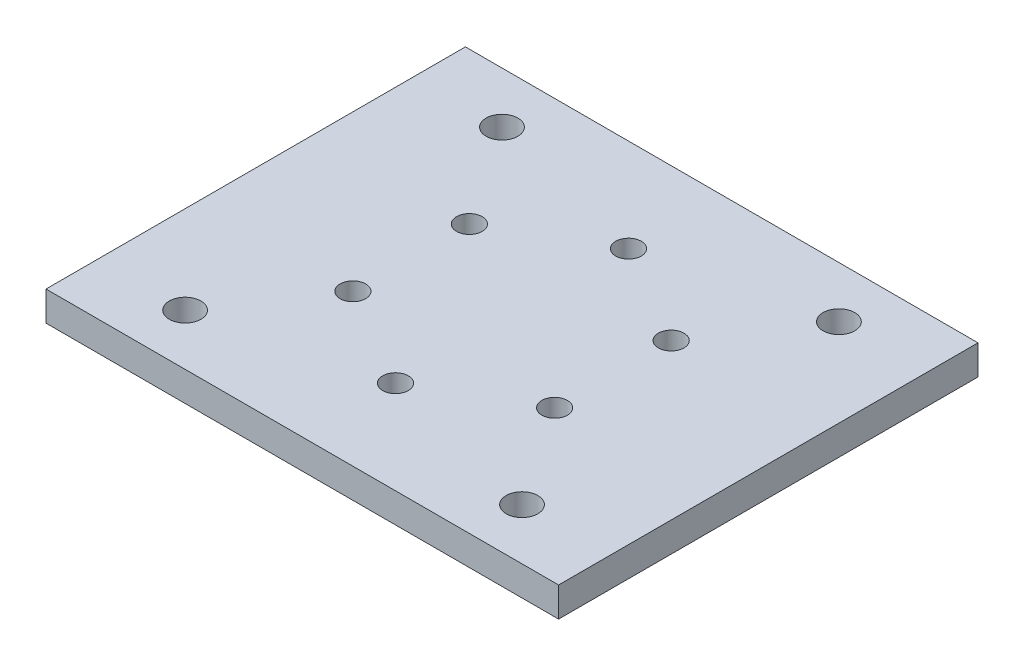
ISO-10303-21;
HEADER;
FILE_DESCRIPTION(('STEP AP214'),'2;1');
FILE_NAME('part.step','',(''),(''),'','','');
FILE_SCHEMA(('AUTOMOTIVE_DESIGN { 1 0 10303 214 1 1 1 1 }'));
ENDSEC;
DATA;
#1=APPLICATION_CONTEXT('core data for automotive mechanical design processes');
#2=APPLICATION_PROTOCOL_DEFINITION('international standard','automotive_design',2000,#1);
#3=PRODUCT_CONTEXT('',#1,'mechanical');
#4=PRODUCT('Part','Part','',(#3));
#5=PRODUCT_RELATED_PRODUCT_CATEGORY('part','',(#4));
#6=PRODUCT_DEFINITION_FORMATION('','',#4);
#7=PRODUCT_DEFINITION_CONTEXT('part definition',#1,'design');
#8=PRODUCT_DEFINITION('design','',#6,#7);
#9=PRODUCT_DEFINITION_SHAPE('','',#8);
#10=(LENGTH_UNIT() NAMED_UNIT(*) SI_UNIT(.MILLI.,.METRE.));
#11=(NAMED_UNIT(*) PLANE_ANGLE_UNIT() SI_UNIT($,.RADIAN.));
#12=(NAMED_UNIT(*) SI_UNIT($,.STERADIAN.) SOLID_ANGLE_UNIT());
#13=UNCERTAINTY_MEASURE_WITH_UNIT(LENGTH_MEASURE(1.E-05),#10,'distance_accuracy_value','');
#14=(GEOMETRIC_REPRESENTATION_CONTEXT(3) GLOBAL_UNCERTAINTY_ASSIGNED_CONTEXT((#13)) GLOBAL_UNIT_ASSIGNED_CONTEXT((#10,
#11,#12)) REPRESENTATION_CONTEXT('',''));
#15=CARTESIAN_POINT('',(0.,0.,0.));
#16=DIRECTION('',(0.,0.,1.));
#17=DIRECTION('',(1.,0.,0.));
#18=AXIS2_PLACEMENT_3D('',#15,#16,#17);
#19=CARTESIAN_POINT('',(110.,6.35,0.));
#20=DIRECTION('',(0.,0.,-1.));
#21=DIRECTION('',(-1.,0.,0.));
#22=AXIS2_PLACEMENT_3D('',#19,#20,#21);
#23=PLANE('',#22);
#24=DIRECTION('',(1.,0.,0.));
#25=VECTOR('',#24,1.);
#26=CARTESIAN_POINT('',(110.,0.,0.));
#27=LINE('',#26,#25);
#28=CARTESIAN_POINT('',(0.,0.,0.));
#29=VERTEX_POINT('',#28);
#30=CARTESIAN_POINT('',(110.,0.,0.));
#31=VERTEX_POINT('',#30);
#32=EDGE_CURVE('E100',#29,#31,#27,.T.);
#33=ORIENTED_EDGE('',*,*,#32,.T.);
#34=DIRECTION('',(0.,-1.,0.));
#35=VECTOR('',#34,1.);
#36=CARTESIAN_POINT('',(110.,6.35,0.));
#37=LINE('',#36,#35);
#38=CARTESIAN_POINT('',(110.,6.35,0.));
#39=VERTEX_POINT('',#38);
#40=EDGE_CURVE('E11',#39,#31,#37,.T.);
#41=ORIENTED_EDGE('',*,*,#40,.F.);
#42=DIRECTION('',(1.,0.,0.));
#43=VECTOR('',#42,1.);
#44=CARTESIAN_POINT('',(110.,6.35,0.));
#45=LINE('',#44,#43);
#46=CARTESIAN_POINT('',(0.,6.35,0.));
#47=VERTEX_POINT('',#46);
#48=EDGE_CURVE('E88',#47,#39,#45,.T.);
#49=ORIENTED_EDGE('',*,*,#48,.F.);
#50=DIRECTION('',(0.,-1.,0.));
#51=VECTOR('',#50,1.);
#52=CARTESIAN_POINT('',(0.,6.35,0.));
#53=LINE('',#52,#51);
#54=EDGE_CURVE('E96',#47,#29,#53,.T.);
#55=ORIENTED_EDGE('',*,*,#54,.T.);
#56=EDGE_LOOP('',(#33,#41,#49,#55));
#57=FACE_BOUND('',#56,.T.);
#58=ADVANCED_FACE('F37',(#57),#23,.F.);
#59=CARTESIAN_POINT('',(110.,6.35,-90.));
#60=DIRECTION('',(-1.,0.,0.));
#61=DIRECTION('',(0.,0.,1.));
#62=AXIS2_PLACEMENT_3D('',#59,#60,#61);
#63=PLANE('',#62);
#64=DIRECTION('',(0.,0.,-1.));
#65=VECTOR('',#64,1.);
#66=CARTESIAN_POINT('',(110.,0.,-90.));
#67=LINE('',#66,#65);
#68=CARTESIAN_POINT('',(110.,0.,-90.));
#69=VERTEX_POINT('',#68);
#70=EDGE_CURVE('E92',#31,#69,#67,.T.);
#71=ORIENTED_EDGE('',*,*,#70,.T.);
#72=DIRECTION('',(0.,-1.,0.));
#73=VECTOR('',#72,1.);
#74=CARTESIAN_POINT('',(110.,6.35,-90.));
#75=LINE('',#74,#73);
#76=CARTESIAN_POINT('',(110.,6.35,-90.));
#77=VERTEX_POINT('',#76);
#78=EDGE_CURVE('E45',#77,#69,#75,.T.);
#79=ORIENTED_EDGE('',*,*,#78,.F.);
#80=DIRECTION('',(0.,0.,-1.));
#81=VECTOR('',#80,1.);
#82=CARTESIAN_POINT('',(110.,6.35,-90.));
#83=LINE('',#82,#81);
#84=EDGE_CURVE('E83',#39,#77,#83,.T.);
#85=ORIENTED_EDGE('',*,*,#84,.F.);
#86=ORIENTED_EDGE('',*,*,#40,.T.);
#87=EDGE_LOOP('',(#71,#79,#85,#86));
#88=FACE_BOUND('',#87,.T.);
#89=ADVANCED_FACE('F91',(#88),#63,.F.);
#90=CARTESIAN_POINT('',(0.,6.35,-90.));
#91=DIRECTION('',(0.,0.,1.));
#92=DIRECTION('',(1.,0.,0.));
#93=AXIS2_PLACEMENT_3D('',#90,#91,#92);
#94=PLANE('',#93);
#95=DIRECTION('',(-1.,0.,0.));
#96=VECTOR('',#95,1.);
#97=CARTESIAN_POINT('',(0.,0.,-90.));
#98=LINE('',#97,#96);
#99=CARTESIAN_POINT('',(0.,0.,-90.));
#100=VERTEX_POINT('',#99);
#101=EDGE_CURVE('E70',#69,#100,#98,.T.);
#102=ORIENTED_EDGE('',*,*,#101,.T.);
#103=DIRECTION('',(0.,-1.,0.));
#104=VECTOR('',#103,1.);
#105=CARTESIAN_POINT('',(0.,6.35,-90.));
#106=LINE('',#105,#104);
#107=CARTESIAN_POINT('',(0.,6.35,-90.));
#108=VERTEX_POINT('',#107);
#109=EDGE_CURVE('E93',#108,#100,#106,.T.);
#110=ORIENTED_EDGE('',*,*,#109,.F.);
#111=DIRECTION('',(-1.,0.,0.));
#112=VECTOR('',#111,1.);
#113=CARTESIAN_POINT('',(0.,6.35,-90.));
#114=LINE('',#113,#112);
#115=EDGE_CURVE('E86',#77,#108,#114,.T.);
#116=ORIENTED_EDGE('',*,*,#115,.F.);
#117=ORIENTED_EDGE('',*,*,#78,.T.);
#118=EDGE_LOOP('',(#102,#110,#116,#117));
#119=FACE_BOUND('',#118,.T.);
#120=ADVANCED_FACE('F94',(#119),#94,.F.);
#121=CARTESIAN_POINT('',(0.,6.35,0.));
#122=DIRECTION('',(1.,0.,0.));
#123=DIRECTION('',(0.,0.,-1.));
#124=AXIS2_PLACEMENT_3D('',#121,#122,#123);
#125=PLANE('',#124);
#126=DIRECTION('',(0.,0.,1.));
#127=VECTOR('',#126,1.);
#128=CARTESIAN_POINT('',(0.,0.,0.));
#129=LINE('',#128,#127);
#130=EDGE_CURVE('E76',#100,#29,#129,.T.);
#131=ORIENTED_EDGE('',*,*,#130,.T.);
#132=ORIENTED_EDGE('',*,*,#54,.F.);
#133=DIRECTION('',(0.,0.,1.));
#134=VECTOR('',#133,1.);
#135=CARTESIAN_POINT('',(0.,6.35,0.));
#136=LINE('',#135,#134);
#137=EDGE_CURVE('E53',#108,#47,#136,.T.);
#138=ORIENTED_EDGE('',*,*,#137,.F.);
#139=ORIENTED_EDGE('',*,*,#109,.T.);
#140=EDGE_LOOP('',(#131,#132,#138,#139));
#141=FACE_BOUND('',#140,.T.);
#142=ADVANCED_FACE('F108',(#141),#125,.F.);
#143=CARTESIAN_POINT('',(0.,6.35,0.));
#144=DIRECTION('',(0.,-1.,0.));
#145=DIRECTION('',(0.,0.,-1.));
#146=AXIS2_PLACEMENT_3D('',#143,#144,#145);
#147=PLANE('',#146);
#148=CARTESIAN_POINT('',(55.,6.35,-70.));
#149=DIRECTION('',(0.,1.,0.));
#150=DIRECTION('',(0.,0.,1.));
#151=AXIS2_PLACEMENT_3D('',#148,#149,#150);
#152=CIRCLE('',#151,2.75);
#153=CARTESIAN_POINT('',(55.,6.35,-67.25));
#154=VERTEX_POINT('',#153);
#155=EDGE_CURVE('E163',#154,#154,#152,.T.);
#156=ORIENTED_EDGE('',*,*,#155,.F.);
#157=EDGE_LOOP('',(#156));
#158=FACE_BOUND('',#157,.T.);
#159=CARTESIAN_POINT('',(33.3493649053895,6.35,-57.4999999999997));
#160=DIRECTION('',(0.,1.,0.));
#161=DIRECTION('',(0.,0.,1.));
#162=AXIS2_PLACEMENT_3D('',#159,#160,#161);
#163=CIRCLE('',#162,2.75);
#164=CARTESIAN_POINT('',(33.3493649053895,6.35,-54.7499999999997));
#165=VERTEX_POINT('',#164);
#166=EDGE_CURVE('E142',#165,#165,#163,.T.);
#167=ORIENTED_EDGE('',*,*,#166,.F.);
#168=EDGE_LOOP('',(#167));
#169=FACE_BOUND('',#168,.T.);
#170=CARTESIAN_POINT('',(33.349364905389,6.35,-32.5));
#171=DIRECTION('',(0.,1.,0.));
#172=DIRECTION('',(0.,0.,1.));
#173=AXIS2_PLACEMENT_3D('',#170,#171,#172);
#174=CIRCLE('',#173,2.75);
#175=CARTESIAN_POINT('',(33.349364905389,6.35,-29.75));
#176=VERTEX_POINT('',#175);
#177=EDGE_CURVE('E141',#176,#176,#174,.T.);
#178=ORIENTED_EDGE('',*,*,#177,.F.);
#179=EDGE_LOOP('',(#178));
#180=FACE_BOUND('',#179,.T.);
#181=CARTESIAN_POINT('',(55.,6.35,-19.9999999999999));
#182=DIRECTION('',(0.,1.,0.));
#183=DIRECTION('',(0.,0.,1.));
#184=AXIS2_PLACEMENT_3D('',#181,#182,#183);
#185=CIRCLE('',#184,2.75);
#186=CARTESIAN_POINT('',(55.,6.35,-17.2499999999999));
#187=VERTEX_POINT('',#186);
#188=EDGE_CURVE('E148',#187,#187,#185,.T.);
#189=ORIENTED_EDGE('',*,*,#188,.F.);
#190=EDGE_LOOP('',(#189));
#191=FACE_BOUND('',#190,.T.);
#192=CARTESIAN_POINT('',(76.650635094611,6.35,-32.4999999999999));
#193=DIRECTION('',(0.,1.,0.));
#194=DIRECTION('',(0.,0.,1.));
#195=AXIS2_PLACEMENT_3D('',#192,#193,#194);
#196=CIRCLE('',#195,2.75000000000001);
#197=CARTESIAN_POINT('',(76.650635094611,6.35,-29.7499999999999));
#198=VERTEX_POINT('',#197);
#199=EDGE_CURVE('E154',#198,#198,#196,.T.);
#200=ORIENTED_EDGE('',*,*,#199,.F.);
#201=EDGE_LOOP('',(#200));
#202=FACE_BOUND('',#201,.T.);
#203=CARTESIAN_POINT('',(76.6506350946114,6.35,-57.5000000000006));
#204=DIRECTION('',(0.,1.,0.));
#205=DIRECTION('',(0.,0.,1.));
#206=AXIS2_PLACEMENT_3D('',#203,#204,#205);
#207=CIRCLE('',#206,2.75000000000001);
#208=CARTESIAN_POINT('',(76.6506350946114,6.35,-54.7500000000006));
#209=VERTEX_POINT('',#208);
#210=EDGE_CURVE('E160',#209,#209,#207,.T.);
#211=ORIENTED_EDGE('',*,*,#210,.F.);
#212=EDGE_LOOP('',(#211));
#213=FACE_BOUND('',#212,.T.);
#214=CARTESIAN_POINT('',(91.1499999999999,6.35,-79.));
#215=DIRECTION('',(0.,1.,0.));
#216=DIRECTION('',(0.,0.,-1.));
#217=AXIS2_PLACEMENT_3D('',#214,#215,#216);
#218=CIRCLE('',#217,3.4);
#219=CARTESIAN_POINT('',(91.1499999999999,6.35,-82.4));
#220=VERTEX_POINT('',#219);
#221=EDGE_CURVE('E123',#220,#220,#218,.T.);
#222=ORIENTED_EDGE('',*,*,#221,.F.);
#223=EDGE_LOOP('',(#222));
#224=FACE_BOUND('',#223,.T.);
#225=CARTESIAN_POINT('',(91.15,6.35,-11.));
#226=DIRECTION('',(0.,1.,0.));
#227=DIRECTION('',(0.,0.,1.));
#228=AXIS2_PLACEMENT_3D('',#225,#226,#227);
#229=CIRCLE('',#228,3.4);
#230=CARTESIAN_POINT('',(91.15,6.35,-7.60000000000002));
#231=VERTEX_POINT('',#230);
#232=EDGE_CURVE('E130',#231,#231,#229,.T.);
#233=ORIENTED_EDGE('',*,*,#232,.F.);
#234=EDGE_LOOP('',(#233));
#235=FACE_BOUND('',#234,.T.);
#236=CARTESIAN_POINT('',(18.85,6.35,-11.));
#237=DIRECTION('',(0.,1.,0.));
#238=DIRECTION('',(0.,0.,-1.));
#239=AXIS2_PLACEMENT_3D('',#236,#237,#238);
#240=CIRCLE('',#239,3.4);
#241=CARTESIAN_POINT('',(18.85,6.35,-14.4));
#242=VERTEX_POINT('',#241);
#243=EDGE_CURVE('E117',#242,#242,#240,.T.);
#244=ORIENTED_EDGE('',*,*,#243,.F.);
#245=EDGE_LOOP('',(#244));
#246=FACE_BOUND('',#245,.T.);
#247=CARTESIAN_POINT('',(18.85,6.35,-79.));
#248=DIRECTION('',(0.,1.,0.));
#249=DIRECTION('',(0.,0.,1.));
#250=AXIS2_PLACEMENT_3D('',#247,#248,#249);
#251=CIRCLE('',#250,3.4);
#252=CARTESIAN_POINT('',(18.85,6.35,-75.6));
#253=VERTEX_POINT('',#252);
#254=EDGE_CURVE('E114',#253,#253,#251,.T.);
#255=ORIENTED_EDGE('',*,*,#254,.F.);
#256=EDGE_LOOP('',(#255));
#257=FACE_BOUND('',#256,.T.);
#258=ORIENTED_EDGE('',*,*,#48,.T.);
#259=ORIENTED_EDGE('',*,*,#84,.T.);
#260=ORIENTED_EDGE('',*,*,#115,.T.);
#261=ORIENTED_EDGE('',*,*,#137,.T.);
#262=EDGE_LOOP('',(#258,#259,#260,#261));
#263=FACE_BOUND('',#262,.T.);
#264=ADVANCED_FACE('F84',(#158,#169,#180,#191,#202,#213,#224,#235,#246,#257,#263),#147,.F.);
#265=CARTESIAN_POINT('',(0.,0.,0.));
#266=DIRECTION('',(0.,-1.,0.));
#267=DIRECTION('',(0.,0.,-1.));
#268=AXIS2_PLACEMENT_3D('',#265,#266,#267);
#269=PLANE('',#268);
#270=CARTESIAN_POINT('',(55.,0.,-70.));
#271=DIRECTION('',(0.,1.,0.));
#272=DIRECTION('',(0.,0.,1.));
#273=AXIS2_PLACEMENT_3D('',#270,#271,#272);
#274=CIRCLE('',#273,2.75);
#275=CARTESIAN_POINT('',(55.,0.,-67.25));
#276=VERTEX_POINT('',#275);
#277=EDGE_CURVE('E124',#276,#276,#274,.T.);
#278=ORIENTED_EDGE('',*,*,#277,.T.);
#279=EDGE_LOOP('',(#278));
#280=FACE_BOUND('',#279,.T.);
#281=CARTESIAN_POINT('',(33.3493649053895,0.,-57.4999999999997));
#282=DIRECTION('',(0.,1.,0.));
#283=DIRECTION('',(0.,0.,1.));
#284=AXIS2_PLACEMENT_3D('',#281,#282,#283);
#285=CIRCLE('',#284,2.75);
#286=CARTESIAN_POINT('',(33.3493649053895,0.,-54.7499999999997));
#287=VERTEX_POINT('',#286);
#288=EDGE_CURVE('E164',#287,#287,#285,.T.);
#289=ORIENTED_EDGE('',*,*,#288,.T.);
#290=EDGE_LOOP('',(#289));
#291=FACE_BOUND('',#290,.T.);
#292=CARTESIAN_POINT('',(33.349364905389,0.,-32.5));
#293=DIRECTION('',(0.,1.,0.));
#294=DIRECTION('',(0.,0.,1.));
#295=AXIS2_PLACEMENT_3D('',#292,#293,#294);
#296=CIRCLE('',#295,2.75);
#297=CARTESIAN_POINT('',(33.349364905389,0.,-29.75));
#298=VERTEX_POINT('',#297);
#299=EDGE_CURVE('E138',#298,#298,#296,.T.);
#300=ORIENTED_EDGE('',*,*,#299,.T.);
#301=EDGE_LOOP('',(#300));
#302=FACE_BOUND('',#301,.T.);
#303=CARTESIAN_POINT('',(55.,0.,-19.9999999999999));
#304=DIRECTION('',(0.,1.,0.));
#305=DIRECTION('',(0.,0.,1.));
#306=AXIS2_PLACEMENT_3D('',#303,#304,#305);
#307=CIRCLE('',#306,2.75);
#308=CARTESIAN_POINT('',(55.,0.,-17.2499999999999));
#309=VERTEX_POINT('',#308);
#310=EDGE_CURVE('E145',#309,#309,#307,.T.);
#311=ORIENTED_EDGE('',*,*,#310,.T.);
#312=EDGE_LOOP('',(#311));
#313=FACE_BOUND('',#312,.T.);
#314=CARTESIAN_POINT('',(76.650635094611,0.,-32.4999999999999));
#315=DIRECTION('',(0.,1.,0.));
#316=DIRECTION('',(0.,0.,1.));
#317=AXIS2_PLACEMENT_3D('',#314,#315,#316);
#318=CIRCLE('',#317,2.75000000000001);
#319=CARTESIAN_POINT('',(76.650635094611,0.,-29.7499999999999));
#320=VERTEX_POINT('',#319);
#321=EDGE_CURVE('E151',#320,#320,#318,.T.);
#322=ORIENTED_EDGE('',*,*,#321,.T.);
#323=EDGE_LOOP('',(#322));
#324=FACE_BOUND('',#323,.T.);
#325=CARTESIAN_POINT('',(76.6506350946114,0.,-57.5000000000006));
#326=DIRECTION('',(0.,1.,0.));
#327=DIRECTION('',(0.,0.,1.));
#328=AXIS2_PLACEMENT_3D('',#325,#326,#327);
#329=CIRCLE('',#328,2.75000000000001);
#330=CARTESIAN_POINT('',(76.6506350946114,0.,-54.7500000000006));
#331=VERTEX_POINT('',#330);
#332=EDGE_CURVE('E157',#331,#331,#329,.T.);
#333=ORIENTED_EDGE('',*,*,#332,.T.);
#334=EDGE_LOOP('',(#333));
#335=FACE_BOUND('',#334,.T.);
#336=CARTESIAN_POINT('',(91.1499999999999,0.,-79.));
#337=DIRECTION('',(0.,1.,0.));
#338=DIRECTION('',(0.,0.,-1.));
#339=AXIS2_PLACEMENT_3D('',#336,#337,#338);
#340=CIRCLE('',#339,3.4);
#341=CARTESIAN_POINT('',(91.1499999999999,0.,-82.4));
#342=VERTEX_POINT('',#341);
#343=EDGE_CURVE('E120',#342,#342,#340,.T.);
#344=ORIENTED_EDGE('',*,*,#343,.T.);
#345=EDGE_LOOP('',(#344));
#346=FACE_BOUND('',#345,.T.);
#347=CARTESIAN_POINT('',(91.15,0.,-11.));
#348=DIRECTION('',(0.,1.,0.));
#349=DIRECTION('',(0.,0.,1.));
#350=AXIS2_PLACEMENT_3D('',#347,#348,#349);
#351=CIRCLE('',#350,3.4);
#352=CARTESIAN_POINT('',(91.15,0.,-7.60000000000002));
#353=VERTEX_POINT('',#352);
#354=EDGE_CURVE('E127',#353,#353,#351,.T.);
#355=ORIENTED_EDGE('',*,*,#354,.T.);
#356=EDGE_LOOP('',(#355));
#357=FACE_BOUND('',#356,.T.);
#358=CARTESIAN_POINT('',(18.85,0.,-11.));
#359=DIRECTION('',(0.,1.,0.));
#360=DIRECTION('',(0.,0.,-1.));
#361=AXIS2_PLACEMENT_3D('',#358,#359,#360);
#362=CIRCLE('',#361,3.4);
#363=CARTESIAN_POINT('',(18.85,0.,-14.4));
#364=VERTEX_POINT('',#363);
#365=EDGE_CURVE('E133',#364,#364,#362,.T.);
#366=ORIENTED_EDGE('',*,*,#365,.T.);
#367=EDGE_LOOP('',(#366));
#368=FACE_BOUND('',#367,.T.);
#369=CARTESIAN_POINT('',(18.85,0.,-79.));
#370=DIRECTION('',(0.,1.,0.));
#371=DIRECTION('',(0.,0.,1.));
#372=AXIS2_PLACEMENT_3D('',#369,#370,#371);
#373=CIRCLE('',#372,3.4);
#374=CARTESIAN_POINT('',(18.85,0.,-75.6));
#375=VERTEX_POINT('',#374);
#376=EDGE_CURVE('E103',#375,#375,#373,.T.);
#377=ORIENTED_EDGE('',*,*,#376,.T.);
#378=EDGE_LOOP('',(#377));
#379=FACE_BOUND('',#378,.T.);
#380=ORIENTED_EDGE('',*,*,#32,.F.);
#381=ORIENTED_EDGE('',*,*,#130,.F.);
#382=ORIENTED_EDGE('',*,*,#101,.F.);
#383=ORIENTED_EDGE('',*,*,#70,.F.);
#384=EDGE_LOOP('',(#380,#381,#382,#383));
#385=FACE_BOUND('',#384,.T.);
#386=ADVANCED_FACE('F111',(#280,#291,#302,#313,#324,#335,#346,#357,#368,#379,#385),#269,.T.);
#387=CARTESIAN_POINT('',(18.85,0.,-79.));
#388=DIRECTION('',(0.,1.,0.));
#389=DIRECTION('',(0.,0.,1.));
#390=AXIS2_PLACEMENT_3D('',#387,#388,#389);
#391=CYLINDRICAL_SURFACE('',#390,3.4);
#392=ORIENTED_EDGE('',*,*,#376,.F.);
#393=EDGE_LOOP('',(#392));
#394=FACE_BOUND('',#393,.T.);
#395=ORIENTED_EDGE('',*,*,#254,.T.);
#396=EDGE_LOOP('',(#395));
#397=FACE_BOUND('',#396,.T.);
#398=ADVANCED_FACE('F204',(#394,#397),#391,.F.);
#399=CARTESIAN_POINT('',(18.85,0.,-11.));
#400=DIRECTION('',(0.,1.,0.));
#401=DIRECTION('',(0.,0.,1.));
#402=AXIS2_PLACEMENT_3D('',#399,#400,#401);
#403=CYLINDRICAL_SURFACE('',#402,3.4);
#404=ORIENTED_EDGE('',*,*,#365,.F.);
#405=EDGE_LOOP('',(#404));
#406=FACE_BOUND('',#405,.T.);
#407=ORIENTED_EDGE('',*,*,#243,.T.);
#408=EDGE_LOOP('',(#407));
#409=FACE_BOUND('',#408,.T.);
#410=ADVANCED_FACE('F206',(#406,#409),#403,.F.);
#411=CARTESIAN_POINT('',(91.15,0.,-11.));
#412=DIRECTION('',(0.,1.,0.));
#413=DIRECTION('',(0.,0.,1.));
#414=AXIS2_PLACEMENT_3D('',#411,#412,#413);
#415=CYLINDRICAL_SURFACE('',#414,3.4);
#416=ORIENTED_EDGE('',*,*,#354,.F.);
#417=EDGE_LOOP('',(#416));
#418=FACE_BOUND('',#417,.T.);
#419=ORIENTED_EDGE('',*,*,#232,.T.);
#420=EDGE_LOOP('',(#419));
#421=FACE_BOUND('',#420,.T.);
#422=ADVANCED_FACE('F213',(#418,#421),#415,.F.);
#423=CARTESIAN_POINT('',(91.1499999999999,0.,-79.));
#424=DIRECTION('',(0.,1.,0.));
#425=DIRECTION('',(0.,0.,1.));
#426=AXIS2_PLACEMENT_3D('',#423,#424,#425);
#427=CYLINDRICAL_SURFACE('',#426,3.4);
#428=ORIENTED_EDGE('',*,*,#343,.F.);
#429=EDGE_LOOP('',(#428));
#430=FACE_BOUND('',#429,.T.);
#431=ORIENTED_EDGE('',*,*,#221,.T.);
#432=EDGE_LOOP('',(#431));
#433=FACE_BOUND('',#432,.T.);
#434=ADVANCED_FACE('F255',(#430,#433),#427,.F.);
#435=CARTESIAN_POINT('',(76.6506350946114,0.,-57.5000000000006));
#436=DIRECTION('',(0.,1.,0.));
#437=DIRECTION('',(0.,0.,1.));
#438=AXIS2_PLACEMENT_3D('',#435,#436,#437);
#439=CYLINDRICAL_SURFACE('',#438,2.75000000000001);
#440=ORIENTED_EDGE('',*,*,#332,.F.);
#441=EDGE_LOOP('',(#440));
#442=FACE_BOUND('',#441,.T.);
#443=ORIENTED_EDGE('',*,*,#210,.T.);
#444=EDGE_LOOP('',(#443));
#445=FACE_BOUND('',#444,.T.);
#446=ADVANCED_FACE('F249',(#442,#445),#439,.F.);
#447=CARTESIAN_POINT('',(76.650635094611,0.,-32.4999999999999));
#448=DIRECTION('',(0.,1.,0.));
#449=DIRECTION('',(0.,0.,1.));
#450=AXIS2_PLACEMENT_3D('',#447,#448,#449);
#451=CYLINDRICAL_SURFACE('',#450,2.75000000000001);
#452=ORIENTED_EDGE('',*,*,#321,.F.);
#453=EDGE_LOOP('',(#452));
#454=FACE_BOUND('',#453,.T.);
#455=ORIENTED_EDGE('',*,*,#199,.T.);
#456=EDGE_LOOP('',(#455));
#457=FACE_BOUND('',#456,.T.);
#458=ADVANCED_FACE('F254',(#454,#457),#451,.F.);
#459=CARTESIAN_POINT('',(55.,0.,-19.9999999999999));
#460=DIRECTION('',(0.,1.,0.));
#461=DIRECTION('',(0.,0.,1.));
#462=AXIS2_PLACEMENT_3D('',#459,#460,#461);
#463=CYLINDRICAL_SURFACE('',#462,2.75);
#464=ORIENTED_EDGE('',*,*,#310,.F.);
#465=EDGE_LOOP('',(#464));
#466=FACE_BOUND('',#465,.T.);
#467=ORIENTED_EDGE('',*,*,#188,.T.);
#468=EDGE_LOOP('',(#467));
#469=FACE_BOUND('',#468,.T.);
#470=ADVANCED_FACE('F268',(#466,#469),#463,.F.);
#471=CARTESIAN_POINT('',(33.349364905389,0.,-32.5));
#472=DIRECTION('',(0.,1.,0.));
#473=DIRECTION('',(0.,0.,1.));
#474=AXIS2_PLACEMENT_3D('',#471,#472,#473);
#475=CYLINDRICAL_SURFACE('',#474,2.75);
#476=ORIENTED_EDGE('',*,*,#299,.F.);
#477=EDGE_LOOP('',(#476));
#478=FACE_BOUND('',#477,.T.);
#479=ORIENTED_EDGE('',*,*,#177,.T.);
#480=EDGE_LOOP('',(#479));
#481=FACE_BOUND('',#480,.T.);
#482=ADVANCED_FACE('F279',(#478,#481),#475,.F.);
#483=CARTESIAN_POINT('',(33.3493649053895,0.,-57.4999999999997));
#484=DIRECTION('',(0.,1.,0.));
#485=DIRECTION('',(0.,0.,1.));
#486=AXIS2_PLACEMENT_3D('',#483,#484,#485);
#487=CYLINDRICAL_SURFACE('',#486,2.75);
#488=ORIENTED_EDGE('',*,*,#288,.F.);
#489=EDGE_LOOP('',(#488));
#490=FACE_BOUND('',#489,.T.);
#491=ORIENTED_EDGE('',*,*,#166,.T.);
#492=EDGE_LOOP('',(#491));
#493=FACE_BOUND('',#492,.T.);
#494=ADVANCED_FACE('F179',(#490,#493),#487,.F.);
#495=CARTESIAN_POINT('',(55.,0.,-70.));
#496=DIRECTION('',(0.,1.,0.));
#497=DIRECTION('',(0.,0.,1.));
#498=AXIS2_PLACEMENT_3D('',#495,#496,#497);
#499=CYLINDRICAL_SURFACE('',#498,2.75);
#500=ORIENTED_EDGE('',*,*,#277,.F.);
#501=EDGE_LOOP('',(#500));
#502=FACE_BOUND('',#501,.T.);
#503=ORIENTED_EDGE('',*,*,#155,.T.);
#504=EDGE_LOOP('',(#503));
#505=FACE_BOUND('',#504,.T.);
#506=ADVANCED_FACE('F176',(#502,#505),#499,.F.);
#507=CLOSED_SHELL('',(#58,#89,#120,#142,#264,#386,#398,#410,#422,#434,#446,#458,#470,#482,#494,#506));
#508=MANIFOLD_SOLID_BREP('B2',#507);
#509=ADVANCED_BREP_SHAPE_REPRESENTATION('',(#18,#508),#14);
#510=SHAPE_DEFINITION_REPRESENTATION(#9,#509);
ENDSEC;
END-ISO-10303-21;
